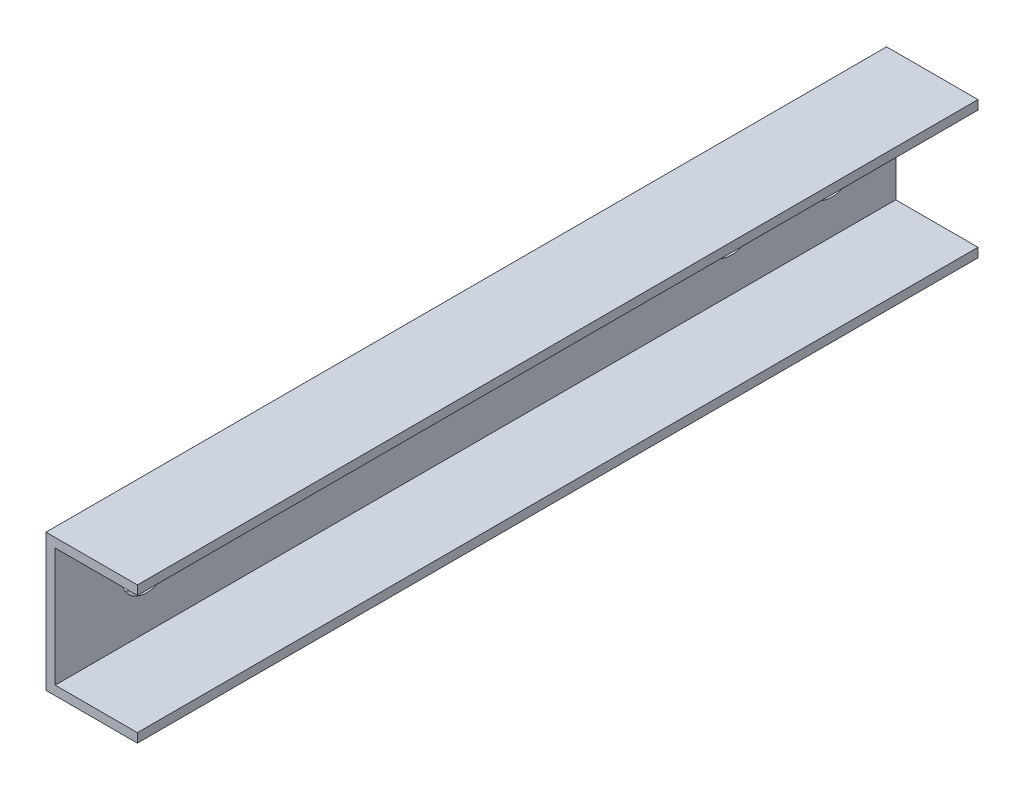
ISO-10303-21;
HEADER;
FILE_DESCRIPTION(('STEP AP214'),'2;1');
FILE_NAME('part.step','',(''),(''),'','','');
FILE_SCHEMA(('AUTOMOTIVE_DESIGN { 1 0 10303 214 1 1 1 1 }'));
ENDSEC;
DATA;
#1=APPLICATION_CONTEXT('core data for automotive mechanical design processes');
#2=APPLICATION_PROTOCOL_DEFINITION('international standard','automotive_design',2000,#1);
#3=PRODUCT_CONTEXT('',#1,'mechanical');
#4=PRODUCT('Part','Part','',(#3));
#5=PRODUCT_RELATED_PRODUCT_CATEGORY('part','',(#4));
#6=PRODUCT_DEFINITION_FORMATION('','',#4);
#7=PRODUCT_DEFINITION_CONTEXT('part definition',#1,'design');
#8=PRODUCT_DEFINITION('design','',#6,#7);
#9=PRODUCT_DEFINITION_SHAPE('','',#8);
#10=(LENGTH_UNIT() NAMED_UNIT(*) SI_UNIT(.MILLI.,.METRE.));
#11=(NAMED_UNIT(*) PLANE_ANGLE_UNIT() SI_UNIT($,.RADIAN.));
#12=(NAMED_UNIT(*) SI_UNIT($,.STERADIAN.) SOLID_ANGLE_UNIT());
#13=UNCERTAINTY_MEASURE_WITH_UNIT(LENGTH_MEASURE(1.E-05),#10,'distance_accuracy_value','');
#14=(GEOMETRIC_REPRESENTATION_CONTEXT(3) GLOBAL_UNCERTAINTY_ASSIGNED_CONTEXT((#13)) GLOBAL_UNIT_ASSIGNED_CONTEXT((#10,
#11,#12)) REPRESENTATION_CONTEXT('',''));
#15=CARTESIAN_POINT('',(0.,0.,0.));
#16=DIRECTION('',(0.,0.,1.));
#17=DIRECTION('',(1.,0.,0.));
#18=AXIS2_PLACEMENT_3D('',#15,#16,#17);
#19=CARTESIAN_POINT('',(10.,0.,0.));
#20=DIRECTION('',(0.,1.,0.));
#21=DIRECTION('',(0.,0.,1.));
#22=AXIS2_PLACEMENT_3D('',#19,#20,#21);
#23=PLANE('',#22);
#24=DIRECTION('',(0.,0.,-1.));
#25=VECTOR('',#24,1.);
#26=CARTESIAN_POINT('',(1.,0.,91.));
#27=LINE('',#26,#25);
#28=CARTESIAN_POINT('',(1.,0.,91.));
#29=VERTEX_POINT('',#28);
#30=CARTESIAN_POINT('',(1.,0.,-1.));
#31=VERTEX_POINT('',#30);
#32=EDGE_CURVE('E144',#29,#31,#27,.T.);
#33=ORIENTED_EDGE('',*,*,#32,.F.);
#34=DIRECTION('',(1.,0.,0.));
#35=VECTOR('',#34,1.);
#36=CARTESIAN_POINT('',(0.,0.,91.));
#37=LINE('',#36,#35);
#38=CARTESIAN_POINT('',(10.,0.,91.));
#39=VERTEX_POINT('',#38);
#40=EDGE_CURVE('E147',#29,#39,#37,.T.);
#41=ORIENTED_EDGE('',*,*,#40,.T.);
#42=DIRECTION('',(0.,0.,-1.));
#43=VECTOR('',#42,1.);
#44=CARTESIAN_POINT('',(10.,0.,0.));
#45=LINE('',#44,#43);
#46=CARTESIAN_POINT('',(10.,0.,-1.));
#47=VERTEX_POINT('',#46);
#48=EDGE_CURVE('E174',#39,#47,#45,.T.);
#49=ORIENTED_EDGE('',*,*,#48,.T.);
#50=DIRECTION('',(1.,0.,0.));
#51=VECTOR('',#50,1.);
#52=CARTESIAN_POINT('',(0.,0.,-1.));
#53=LINE('',#52,#51);
#54=EDGE_CURVE('E148',#31,#47,#53,.T.);
#55=ORIENTED_EDGE('',*,*,#54,.F.);
#56=EDGE_LOOP('',(#33,#41,#49,#55));
#57=FACE_BOUND('',#56,.T.);
#58=ADVANCED_FACE('F66',(#57),#23,.T.);
#59=CARTESIAN_POINT('',(10.,13.,0.));
#60=DIRECTION('',(0.,-1.,0.));
#61=DIRECTION('',(0.,0.,-1.));
#62=AXIS2_PLACEMENT_3D('',#59,#60,#61);
#63=PLANE('',#62);
#64=DIRECTION('',(1.,0.,0.));
#65=VECTOR('',#64,1.);
#66=CARTESIAN_POINT('',(0.,13.,91.));
#67=LINE('',#66,#65);
#68=CARTESIAN_POINT('',(1.,13.,91.));
#69=VERTEX_POINT('',#68);
#70=CARTESIAN_POINT('',(10.,13.,91.));
#71=VERTEX_POINT('',#70);
#72=EDGE_CURVE('E153',#69,#71,#67,.T.);
#73=ORIENTED_EDGE('',*,*,#72,.F.);
#74=DIRECTION('',(0.,0.,-1.));
#75=VECTOR('',#74,1.);
#76=CARTESIAN_POINT('',(1.,13.,91.));
#77=LINE('',#76,#75);
#78=CARTESIAN_POINT('',(1.,13.,-1.));
#79=VERTEX_POINT('',#78);
#80=EDGE_CURVE('E152',#69,#79,#77,.T.);
#81=ORIENTED_EDGE('',*,*,#80,.T.);
#82=DIRECTION('',(1.,0.,0.));
#83=VECTOR('',#82,1.);
#84=CARTESIAN_POINT('',(0.,13.,-1.));
#85=LINE('',#84,#83);
#86=CARTESIAN_POINT('',(10.,13.,-1.));
#87=VERTEX_POINT('',#86);
#88=EDGE_CURVE('E162',#79,#87,#85,.T.);
#89=ORIENTED_EDGE('',*,*,#88,.T.);
#90=DIRECTION('',(0.,0.,1.));
#91=VECTOR('',#90,1.);
#92=CARTESIAN_POINT('',(10.,13.,0.));
#93=LINE('',#92,#91);
#94=EDGE_CURVE('E177',#87,#71,#93,.T.);
#95=ORIENTED_EDGE('',*,*,#94,.T.);
#96=EDGE_LOOP('',(#73,#81,#89,#95));
#97=FACE_BOUND('',#96,.T.);
#98=ADVANCED_FACE('F224',(#97),#63,.T.);
#99=CARTESIAN_POINT('',(10.,0.,0.));
#100=DIRECTION('',(1.,0.,0.));
#101=DIRECTION('',(0.,0.,-1.));
#102=AXIS2_PLACEMENT_3D('',#99,#100,#101);
#103=PLANE('',#102);
#104=DIRECTION('',(0.,1.,0.));
#105=VECTOR('',#104,1.);
#106=CARTESIAN_POINT('',(10.,0.,-1.));
#107=LINE('',#106,#105);
#108=CARTESIAN_POINT('',(10.,-1.,-1.));
#109=VERTEX_POINT('',#108);
#110=EDGE_CURVE('E117',#109,#47,#107,.T.);
#111=ORIENTED_EDGE('',*,*,#110,.T.);
#112=ORIENTED_EDGE('',*,*,#48,.F.);
#113=DIRECTION('',(0.,-1.,0.));
#114=VECTOR('',#113,1.);
#115=CARTESIAN_POINT('',(10.,0.,91.));
#116=LINE('',#115,#114);
#117=CARTESIAN_POINT('',(10.,-1.,91.));
#118=VERTEX_POINT('',#117);
#119=EDGE_CURVE('E85',#39,#118,#116,.T.);
#120=ORIENTED_EDGE('',*,*,#119,.T.);
#121=DIRECTION('',(0.,0.,-1.));
#122=VECTOR('',#121,1.);
#123=CARTESIAN_POINT('',(10.,-1.,0.));
#124=LINE('',#123,#122);
#125=EDGE_CURVE('E180',#118,#109,#124,.T.);
#126=ORIENTED_EDGE('',*,*,#125,.T.);
#127=EDGE_LOOP('',(#111,#112,#120,#126));
#128=FACE_BOUND('',#127,.T.);
#129=ADVANCED_FACE('F230',(#128),#103,.T.);
#130=CARTESIAN_POINT('',(10.,0.,-1.));
#131=DIRECTION('',(0.,0.,1.));
#132=DIRECTION('',(1.,0.,0.));
#133=AXIS2_PLACEMENT_3D('',#130,#131,#132);
#134=PLANE('',#133);
#135=ORIENTED_EDGE('',*,*,#54,.T.);
#136=ORIENTED_EDGE('',*,*,#110,.F.);
#137=DIRECTION('',(-1.,0.,0.));
#138=VECTOR('',#137,1.);
#139=CARTESIAN_POINT('',(10.,-1.,-1.));
#140=LINE('',#139,#138);
#141=CARTESIAN_POINT('',(0.,-1.,-1.));
#142=VERTEX_POINT('',#141);
#143=EDGE_CURVE('E12',#109,#142,#140,.T.);
#144=ORIENTED_EDGE('',*,*,#143,.T.);
#145=DIRECTION('',(0.,1.,0.));
#146=VECTOR('',#145,1.);
#147=CARTESIAN_POINT('',(0.,0.,-1.));
#148=LINE('',#147,#146);
#149=CARTESIAN_POINT('',(0.,14.,-1.));
#150=VERTEX_POINT('',#149);
#151=EDGE_CURVE('E192',#142,#150,#148,.T.);
#152=ORIENTED_EDGE('',*,*,#151,.T.);
#153=DIRECTION('',(-1.,0.,0.));
#154=VECTOR('',#153,1.);
#155=CARTESIAN_POINT('',(10.,14.,-1.));
#156=LINE('',#155,#154);
#157=CARTESIAN_POINT('',(10.,14.,-1.));
#158=VERTEX_POINT('',#157);
#159=EDGE_CURVE('E76',#158,#150,#156,.T.);
#160=ORIENTED_EDGE('',*,*,#159,.F.);
#161=EDGE_CURVE('E182',#87,#158,#107,.T.);
#162=ORIENTED_EDGE('',*,*,#161,.F.);
#163=ORIENTED_EDGE('',*,*,#88,.F.);
#164=DIRECTION('',(0.,1.,0.));
#165=VECTOR('',#164,1.);
#166=CARTESIAN_POINT('',(1.,0.,-1.));
#167=LINE('',#166,#165);
#168=EDGE_CURVE('E165',#31,#79,#167,.T.);
#169=ORIENTED_EDGE('',*,*,#168,.F.);
#170=EDGE_LOOP('',(#135,#136,#144,#152,#160,#162,#163,#169));
#171=FACE_BOUND('',#170,.T.);
#172=ADVANCED_FACE('F244',(#171),#134,.F.);
#173=CARTESIAN_POINT('',(10.,0.,91.));
#174=DIRECTION('',(0.,0.,-1.));
#175=DIRECTION('',(-1.,0.,0.));
#176=AXIS2_PLACEMENT_3D('',#173,#174,#175);
#177=PLANE('',#176);
#178=ORIENTED_EDGE('',*,*,#40,.F.);
#179=DIRECTION('',(0.,1.,0.));
#180=VECTOR('',#179,1.);
#181=CARTESIAN_POINT('',(1.,0.,91.));
#182=LINE('',#181,#180);
#183=EDGE_CURVE('E156',#29,#69,#182,.T.);
#184=ORIENTED_EDGE('',*,*,#183,.T.);
#185=ORIENTED_EDGE('',*,*,#72,.T.);
#186=CARTESIAN_POINT('',(10.,14.,91.));
#187=VERTEX_POINT('',#186);
#188=EDGE_CURVE('E186',#187,#71,#116,.T.);
#189=ORIENTED_EDGE('',*,*,#188,.F.);
#190=DIRECTION('',(-1.,0.,0.));
#191=VECTOR('',#190,1.);
#192=CARTESIAN_POINT('',(10.,14.,91.));
#193=LINE('',#192,#191);
#194=CARTESIAN_POINT('',(0.,14.,91.));
#195=VERTEX_POINT('',#194);
#196=EDGE_CURVE('E197',#187,#195,#193,.T.);
#197=ORIENTED_EDGE('',*,*,#196,.T.);
#198=DIRECTION('',(0.,-1.,0.));
#199=VECTOR('',#198,1.);
#200=CARTESIAN_POINT('',(0.,0.,91.));
#201=LINE('',#200,#199);
#202=CARTESIAN_POINT('',(0.,-1.,91.));
#203=VERTEX_POINT('',#202);
#204=EDGE_CURVE('E110',#195,#203,#201,.T.);
#205=ORIENTED_EDGE('',*,*,#204,.T.);
#206=DIRECTION('',(-1.,0.,0.));
#207=VECTOR('',#206,1.);
#208=CARTESIAN_POINT('',(10.,-1.,91.));
#209=LINE('',#208,#207);
#210=EDGE_CURVE('E189',#118,#203,#209,.T.);
#211=ORIENTED_EDGE('',*,*,#210,.F.);
#212=ORIENTED_EDGE('',*,*,#119,.F.);
#213=EDGE_LOOP('',(#178,#184,#185,#189,#197,#205,#211,#212));
#214=FACE_BOUND('',#213,.T.);
#215=ADVANCED_FACE('F161',(#214),#177,.F.);
#216=ORIENTED_EDGE('',*,*,#94,.F.);
#217=ORIENTED_EDGE('',*,*,#161,.T.);
#218=DIRECTION('',(0.,0.,1.));
#219=VECTOR('',#218,1.);
#220=CARTESIAN_POINT('',(10.,14.,0.));
#221=LINE('',#220,#219);
#222=EDGE_CURVE('E184',#158,#187,#221,.T.);
#223=ORIENTED_EDGE('',*,*,#222,.T.);
#224=ORIENTED_EDGE('',*,*,#188,.T.);
#225=EDGE_LOOP('',(#216,#217,#223,#224));
#226=FACE_BOUND('',#225,.T.);
#227=ADVANCED_FACE('F235',(#226),#103,.T.);
#228=CARTESIAN_POINT('',(0.,0.,0.));
#229=DIRECTION('',(1.,0.,0.));
#230=DIRECTION('',(0.,0.,-1.));
#231=AXIS2_PLACEMENT_3D('',#228,#229,#230);
#232=PLANE('',#231);
#233=CARTESIAN_POINT('',(0.,6.50000000000001,5.99999999999999));
#234=DIRECTION('',(1.,0.,0.));
#235=DIRECTION('',(0.,1.,0.));
#236=AXIS2_PLACEMENT_3D('',#233,#234,#235);
#237=CIRCLE('',#236,2.74999999999998);
#238=CARTESIAN_POINT('',(0.,9.25,5.99999999999999));
#239=VERTEX_POINT('',#238);
#240=EDGE_CURVE('E356',#239,#239,#237,.T.);
#241=ORIENTED_EDGE('',*,*,#240,.T.);
#242=EDGE_LOOP('',(#241));
#243=FACE_BOUND('',#242,.T.);
#244=CARTESIAN_POINT('',(0.,6.5,81.));
#245=DIRECTION('',(1.,0.,0.));
#246=DIRECTION('',(0.,1.,0.));
#247=AXIS2_PLACEMENT_3D('',#244,#245,#246);
#248=CIRCLE('',#247,2.75);
#249=CARTESIAN_POINT('',(0.,9.25,81.));
#250=VERTEX_POINT('',#249);
#251=EDGE_CURVE('E354',#250,#250,#248,.T.);
#252=ORIENTED_EDGE('',*,*,#251,.T.);
#253=EDGE_LOOP('',(#252));
#254=FACE_BOUND('',#253,.T.);
#255=CARTESIAN_POINT('',(0.,6.50000000000001,17.));
#256=DIRECTION('',(1.,0.,0.));
#257=DIRECTION('',(0.,1.,0.));
#258=AXIS2_PLACEMENT_3D('',#255,#256,#257);
#259=CIRCLE('',#258,2.75);
#260=CARTESIAN_POINT('',(0.,9.25000000000001,17.));
#261=VERTEX_POINT('',#260);
#262=EDGE_CURVE('E168',#261,#261,#259,.T.);
#263=ORIENTED_EDGE('',*,*,#262,.T.);
#264=EDGE_LOOP('',(#263));
#265=FACE_BOUND('',#264,.T.);
#266=DIRECTION('',(0.,0.,-1.));
#267=VECTOR('',#266,1.);
#268=CARTESIAN_POINT('',(0.,-1.,0.));
#269=LINE('',#268,#267);
#270=EDGE_CURVE('E179',#203,#142,#269,.T.);
#271=ORIENTED_EDGE('',*,*,#270,.F.);
#272=ORIENTED_EDGE('',*,*,#204,.F.);
#273=DIRECTION('',(0.,0.,1.));
#274=VECTOR('',#273,1.);
#275=CARTESIAN_POINT('',(0.,14.,0.));
#276=LINE('',#275,#274);
#277=EDGE_CURVE('E104',#150,#195,#276,.T.);
#278=ORIENTED_EDGE('',*,*,#277,.F.);
#279=ORIENTED_EDGE('',*,*,#151,.F.);
#280=EDGE_LOOP('',(#271,#272,#278,#279));
#281=FACE_BOUND('',#280,.T.);
#282=ADVANCED_FACE('F237',(#243,#254,#265,#281),#232,.F.);
#283=CARTESIAN_POINT('',(10.,-1.,0.));
#284=DIRECTION('',(0.,1.,0.));
#285=DIRECTION('',(0.,0.,1.));
#286=AXIS2_PLACEMENT_3D('',#283,#284,#285);
#287=PLANE('',#286);
#288=ORIENTED_EDGE('',*,*,#270,.T.);
#289=ORIENTED_EDGE('',*,*,#143,.F.);
#290=ORIENTED_EDGE('',*,*,#125,.F.);
#291=ORIENTED_EDGE('',*,*,#210,.T.);
#292=EDGE_LOOP('',(#288,#289,#290,#291));
#293=FACE_BOUND('',#292,.T.);
#294=ADVANCED_FACE('F68',(#293),#287,.F.);
#295=CARTESIAN_POINT('',(10.,14.,0.));
#296=DIRECTION('',(0.,-1.,0.));
#297=DIRECTION('',(0.,0.,-1.));
#298=AXIS2_PLACEMENT_3D('',#295,#296,#297);
#299=PLANE('',#298);
#300=ORIENTED_EDGE('',*,*,#277,.T.);
#301=ORIENTED_EDGE('',*,*,#196,.F.);
#302=ORIENTED_EDGE('',*,*,#222,.F.);
#303=ORIENTED_EDGE('',*,*,#159,.T.);
#304=EDGE_LOOP('',(#300,#301,#302,#303));
#305=FACE_BOUND('',#304,.T.);
#306=ADVANCED_FACE('F245',(#305),#299,.F.);
#307=CARTESIAN_POINT('',(1.,0.,91.));
#308=DIRECTION('',(-1.,0.,0.));
#309=DIRECTION('',(0.,-1.,0.));
#310=AXIS2_PLACEMENT_3D('',#307,#308,#309);
#311=PLANE('',#310);
#312=CARTESIAN_POINT('',(1.,6.50000000000001,5.99999999999999));
#313=DIRECTION('',(-1.,0.,0.));
#314=DIRECTION('',(0.,-1.,0.));
#315=AXIS2_PLACEMENT_3D('',#312,#313,#314);
#316=CIRCLE('',#315,2.74999999999998);
#317=CARTESIAN_POINT('',(1.,3.75000000000003,5.99999999999999));
#318=VERTEX_POINT('',#317);
#319=EDGE_CURVE('E70',#318,#318,#316,.T.);
#320=ORIENTED_EDGE('',*,*,#319,.T.);
#321=EDGE_LOOP('',(#320));
#322=FACE_BOUND('',#321,.T.);
#323=CARTESIAN_POINT('',(1.,6.5,81.));
#324=DIRECTION('',(-1.,0.,0.));
#325=DIRECTION('',(0.,-1.,0.));
#326=AXIS2_PLACEMENT_3D('',#323,#324,#325);
#327=CIRCLE('',#326,2.75);
#328=CARTESIAN_POINT('',(1.,3.75,81.));
#329=VERTEX_POINT('',#328);
#330=EDGE_CURVE('E202',#329,#329,#327,.T.);
#331=ORIENTED_EDGE('',*,*,#330,.T.);
#332=EDGE_LOOP('',(#331));
#333=FACE_BOUND('',#332,.T.);
#334=CARTESIAN_POINT('',(1.,6.50000000000001,17.));
#335=DIRECTION('',(-1.,0.,0.));
#336=DIRECTION('',(0.,-1.,0.));
#337=AXIS2_PLACEMENT_3D('',#334,#335,#336);
#338=CIRCLE('',#337,2.75);
#339=CARTESIAN_POINT('',(1.,3.75000000000001,17.));
#340=VERTEX_POINT('',#339);
#341=EDGE_CURVE('E200',#340,#340,#338,.T.);
#342=ORIENTED_EDGE('',*,*,#341,.T.);
#343=EDGE_LOOP('',(#342));
#344=FACE_BOUND('',#343,.T.);
#345=ORIENTED_EDGE('',*,*,#80,.F.);
#346=ORIENTED_EDGE('',*,*,#183,.F.);
#347=ORIENTED_EDGE('',*,*,#32,.T.);
#348=ORIENTED_EDGE('',*,*,#168,.T.);
#349=EDGE_LOOP('',(#345,#346,#347,#348));
#350=FACE_BOUND('',#349,.T.);
#351=ADVANCED_FACE('F157',(#322,#333,#344,#350),#311,.F.);
#352=CARTESIAN_POINT('',(0.,6.50000000000001,17.));
#353=DIRECTION('',(1.,0.,0.));
#354=DIRECTION('',(0.,1.,0.));
#355=AXIS2_PLACEMENT_3D('',#352,#353,#354);
#356=CYLINDRICAL_SURFACE('',#355,2.75);
#357=ORIENTED_EDGE('',*,*,#262,.F.);
#358=EDGE_LOOP('',(#357));
#359=FACE_BOUND('',#358,.T.);
#360=ORIENTED_EDGE('',*,*,#341,.F.);
#361=EDGE_LOOP('',(#360));
#362=FACE_BOUND('',#361,.T.);
#363=ADVANCED_FACE('F218',(#359,#362),#356,.F.);
#364=CARTESIAN_POINT('',(0.,6.5,81.));
#365=DIRECTION('',(1.,0.,0.));
#366=DIRECTION('',(0.,1.,0.));
#367=AXIS2_PLACEMENT_3D('',#364,#365,#366);
#368=CYLINDRICAL_SURFACE('',#367,2.75);
#369=ORIENTED_EDGE('',*,*,#251,.F.);
#370=EDGE_LOOP('',(#369));
#371=FACE_BOUND('',#370,.T.);
#372=ORIENTED_EDGE('',*,*,#330,.F.);
#373=EDGE_LOOP('',(#372));
#374=FACE_BOUND('',#373,.T.);
#375=ADVANCED_FACE('F212',(#371,#374),#368,.F.);
#376=CARTESIAN_POINT('',(0.,6.50000000000001,5.99999999999999));
#377=DIRECTION('',(1.,0.,0.));
#378=DIRECTION('',(0.,1.,0.));
#379=AXIS2_PLACEMENT_3D('',#376,#377,#378);
#380=CYLINDRICAL_SURFACE('',#379,2.74999999999998);
#381=ORIENTED_EDGE('',*,*,#240,.F.);
#382=EDGE_LOOP('',(#381));
#383=FACE_BOUND('',#382,.T.);
#384=ORIENTED_EDGE('',*,*,#319,.F.);
#385=EDGE_LOOP('',(#384));
#386=FACE_BOUND('',#385,.T.);
#387=ADVANCED_FACE('F210',(#383,#386),#380,.F.);
#388=CLOSED_SHELL('',(#58,#98,#129,#172,#215,#227,#282,#294,#306,#351,#363,#375,#387));
#389=MANIFOLD_SOLID_BREP('B2',#388);
#390=ADVANCED_BREP_SHAPE_REPRESENTATION('',(#18,#389),#14);
#391=SHAPE_DEFINITION_REPRESENTATION(#9,#390);
ENDSEC;
END-ISO-10303-21;
